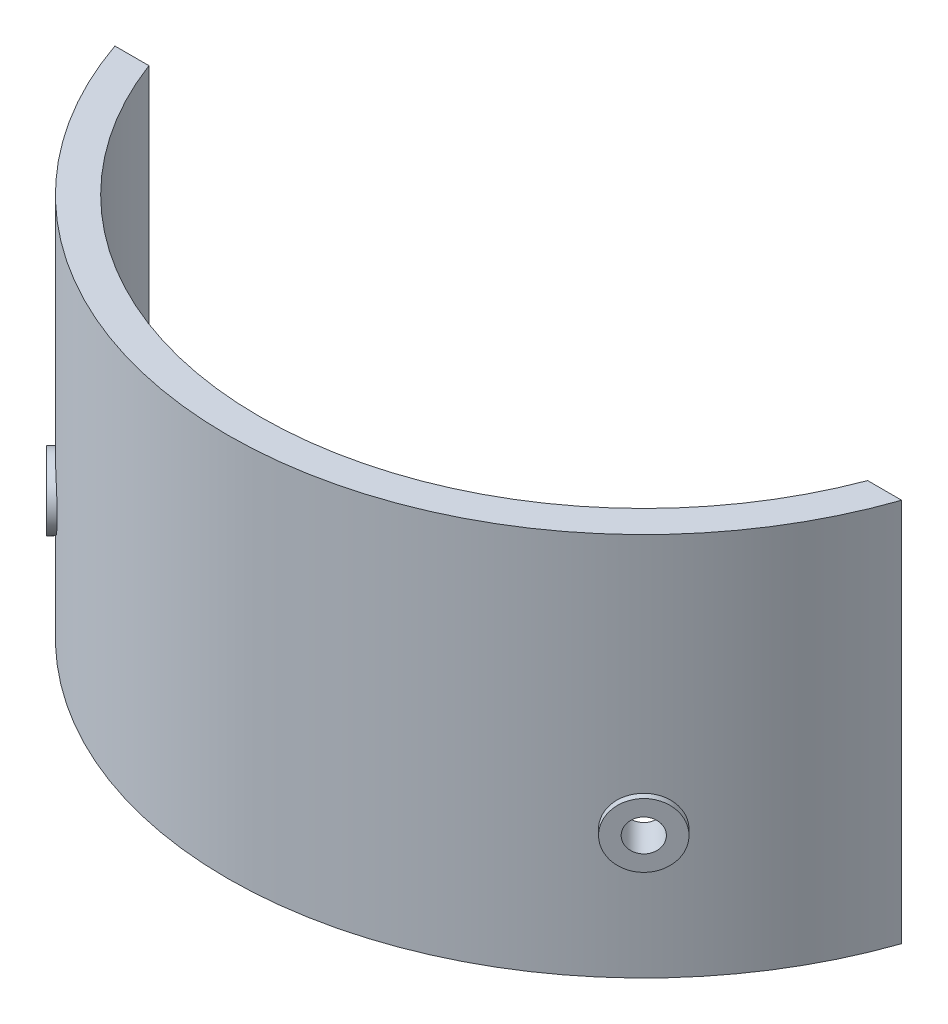
ISO-10303-21;
HEADER;
FILE_DESCRIPTION(('STEP AP214'),'2;1');
FILE_NAME('part.step','',(''),(''),'','','');
FILE_SCHEMA(('AUTOMOTIVE_DESIGN { 1 0 10303 214 1 1 1 1 }'));
ENDSEC;
DATA;
#1=APPLICATION_CONTEXT('core data for automotive mechanical design processes');
#2=APPLICATION_PROTOCOL_DEFINITION('international standard','automotive_design',2000,#1);
#3=PRODUCT_CONTEXT('',#1,'mechanical');
#4=PRODUCT('Part','Part','',(#3));
#5=PRODUCT_RELATED_PRODUCT_CATEGORY('part','',(#4));
#6=PRODUCT_DEFINITION_FORMATION('','',#4);
#7=PRODUCT_DEFINITION_CONTEXT('part definition',#1,'design');
#8=PRODUCT_DEFINITION('design','',#6,#7);
#9=PRODUCT_DEFINITION_SHAPE('','',#8);
#10=(LENGTH_UNIT() NAMED_UNIT(*) SI_UNIT(.MILLI.,.METRE.));
#11=(NAMED_UNIT(*) PLANE_ANGLE_UNIT() SI_UNIT($,.RADIAN.));
#12=(NAMED_UNIT(*) SI_UNIT($,.STERADIAN.) SOLID_ANGLE_UNIT());
#13=UNCERTAINTY_MEASURE_WITH_UNIT(LENGTH_MEASURE(1.E-05),#10,'distance_accuracy_value','');
#14=(GEOMETRIC_REPRESENTATION_CONTEXT(3) GLOBAL_UNCERTAINTY_ASSIGNED_CONTEXT((#13)) GLOBAL_UNIT_ASSIGNED_CONTEXT((#10,
#11,#12)) REPRESENTATION_CONTEXT('',''));
#15=CARTESIAN_POINT('',(0.,0.,0.));
#16=DIRECTION('',(0.,0.,1.));
#17=DIRECTION('',(1.,0.,0.));
#18=AXIS2_PLACEMENT_3D('',#15,#16,#17);
#19=CARTESIAN_POINT('',(0.,36.,0.));
#20=DIRECTION('',(0.,-1.,0.));
#21=DIRECTION('',(0.,0.,-1.));
#22=AXIS2_PLACEMENT_3D('',#19,#20,#21);
#23=CYLINDRICAL_SURFACE('',#22,36.);
#24=CARTESIAN_POINT('',(-26.4943976084996,12.,24.3730772649399));
#25=CARTESIAN_POINT('',(-26.4943952739119,11.9157835874304,24.3730801947325));
#26=CARTESIAN_POINT('',(-26.4895770731952,11.831507040874,24.3783205820329));
#27=CARTESIAN_POINT('',(-26.4704068180214,11.6652776602839,24.3991343156079));
#28=CARTESIAN_POINT('',(-26.456043456278,11.5833277025484,24.4147199168932));
#29=CARTESIAN_POINT('',(-26.4181422705606,11.4241836294283,24.455725996031));
#30=CARTESIAN_POINT('',(-26.3946090333823,11.346987158658,24.4811415568651));
#31=CARTESIAN_POINT('',(-26.33896364543,11.1995213175581,24.540999487088));
#32=CARTESIAN_POINT('',(-26.3068535526658,11.1292502910039,24.5754396909836));
#33=CARTESIAN_POINT('',(-26.2348406309579,10.9975563413775,24.6523001749192));
#34=CARTESIAN_POINT('',(-26.1949327728728,10.9361391732318,24.6947256043506));
#35=CARTESIAN_POINT('',(-26.1083602695939,10.8239452186071,24.7862357537321));
#36=CARTESIAN_POINT('',(-26.0616953519546,10.7731688613689,24.8353207421913));
#37=CARTESIAN_POINT('',(-25.9628122963476,10.6836840741825,24.9386745158446));
#38=CARTESIAN_POINT('',(-25.9105922455811,10.6449798191754,24.9929450859307));
#39=CARTESIAN_POINT('',(-25.8020073064117,10.5807647946425,25.1050293998376));
#40=CARTESIAN_POINT('',(-25.7456424423306,10.5552539477044,25.1628431228668));
#41=CARTESIAN_POINT('',(-25.6303418570092,10.5181642560097,25.2802757069657));
#42=CARTESIAN_POINT('',(-25.5714076619969,10.5065772540131,25.3398934901227));
#43=CARTESIAN_POINT('',(-25.4525837020591,10.4976390046214,25.4592433655442));
#44=CARTESIAN_POINT('',(-25.3926939428863,10.5002876715542,25.5189754571187));
#45=CARTESIAN_POINT('',(-25.2737047993608,10.5197387684018,25.6368261541523));
#46=CARTESIAN_POINT('',(-25.2146049474505,10.5365324111562,25.6949457381872));
#47=CARTESIAN_POINT('',(-25.0988752611399,10.5837831386145,25.8080028113925));
#48=CARTESIAN_POINT('',(-25.042245434756,10.6142402676591,25.8629402902357));
#49=CARTESIAN_POINT('',(-24.9331141735106,10.6879634533803,25.9681645796129));
#50=CARTESIAN_POINT('',(-24.880614039244,10.7312335250534,26.0184499258872));
#51=CARTESIAN_POINT('',(-24.7813408930378,10.8293513696792,26.1130207257994));
#52=CARTESIAN_POINT('',(-24.7345679084893,10.8841991980013,26.1573061507417));
#53=CARTESIAN_POINT('',(-24.6481442430487,11.0039653307972,26.2387599284347));
#54=CARTESIAN_POINT('',(-24.6084990028827,11.0688912582071,26.2759228458728));
#55=CARTESIAN_POINT('',(-24.5376037327839,11.2069437541272,26.3421404584948));
#56=CARTESIAN_POINT('',(-24.5063537046218,11.2800703243671,26.3711951519682));
#57=CARTESIAN_POINT('',(-24.4532291496454,11.4324528070875,26.4204637226725));
#58=CARTESIAN_POINT('',(-24.4313548195256,11.5117088481181,26.4406774144263));
#59=CARTESIAN_POINT('',(-24.3976764459135,11.674098455893,26.4717569057697));
#60=CARTESIAN_POINT('',(-24.385872349777,11.7572320023643,26.482622754227));
#61=CARTESIAN_POINT('',(-24.3727161490521,11.9249498126521,26.494731347306));
#62=CARTESIAN_POINT('',(-24.3713561917812,12.0095329385983,26.49598132186));
#63=CARTESIAN_POINT('',(-24.379111033573,12.1778077340019,26.4888461792357));
#64=CARTESIAN_POINT('',(-24.388225808752,12.2614994054916,26.4804610840267));
#65=CARTESIAN_POINT('',(-24.4166340781954,12.4255857324783,26.4542690221922));
#66=CARTESIAN_POINT('',(-24.4359239995682,12.5059815346113,26.4364653627864));
#67=CARTESIAN_POINT('',(-24.4840687251641,12.6612292529208,26.3918822530652));
#68=CARTESIAN_POINT('',(-24.5129235675519,12.7360811469753,26.3651027669355));
#69=CARTESIAN_POINT('',(-24.5793116970292,12.8781653761809,26.3032220281291));
#70=CARTESIAN_POINT('',(-24.6168501626974,12.9453931287933,26.2681158093917));
#71=CARTESIAN_POINT('',(-24.6994295967995,13.0702746620675,26.1904826344166));
#72=CARTESIAN_POINT('',(-24.7444705994151,13.1279283991077,26.1479556443696));
#73=CARTESIAN_POINT('',(-24.8407038090013,13.2320610504681,26.0565506637861));
#74=CARTESIAN_POINT('',(-24.8918997756704,13.2785330820084,26.0076687899338));
#75=CARTESIAN_POINT('',(-24.9988718094946,13.3589361096369,25.904862555006));
#76=CARTESIAN_POINT('',(-25.0546478612858,13.3928671477916,25.8509382108454));
#77=CARTESIAN_POINT('',(-25.1691001975252,13.4472129494855,25.7395176015354));
#78=CARTESIAN_POINT('',(-25.2277755247775,13.4676321423399,25.682022513678));
#79=CARTESIAN_POINT('',(-25.3463265227888,13.4943891401111,25.5650281534838));
#80=CARTESIAN_POINT('',(-25.4062021895074,13.5007269924174,25.5055288878925));
#81=CARTESIAN_POINT('',(-25.5253899339552,13.4991408989045,25.3862476950968));
#82=CARTESIAN_POINT('',(-25.58470240471,13.4912277667478,25.3264660165156));
#83=CARTESIAN_POINT('',(-25.7011457879523,13.4613866388985,25.2082920729372));
#84=CARTESIAN_POINT('',(-25.7582766962169,13.4394586160776,25.1498998106297));
#85=CARTESIAN_POINT('',(-25.8687903011385,13.3822121668092,25.036213340826));
#86=CARTESIAN_POINT('',(-25.9221729499724,13.3468935695511,24.9809191728594));
#87=CARTESIAN_POINT('',(-26.0237564298485,13.2638708757159,24.8750776667383));
#88=CARTESIAN_POINT('',(-26.0719574333728,13.2161671915831,24.8245301705879));
#89=CARTESIAN_POINT('',(-26.1619446460311,13.1096914207276,24.7296772549363));
#90=CARTESIAN_POINT('',(-26.203726658424,13.050912148212,24.6853759207241));
#91=CARTESIAN_POINT('',(-26.2797706924186,12.923951838657,24.6044050265411));
#92=CARTESIAN_POINT('',(-26.3140308556938,12.8557684850315,24.5677373526362));
#93=CARTESIAN_POINT('',(-26.3741711752369,12.7118948004059,24.503164073359));
#94=CARTESIAN_POINT('',(-26.4000445212428,12.6361984335083,24.4752655892971));
#95=CARTESIAN_POINT('',(-26.4426991242894,12.4795479402464,24.4291763771393));
#96=CARTESIAN_POINT('',(-26.4594911699732,12.3986001812397,24.410974130239));
#97=CARTESIAN_POINT('',(-26.4791413510393,12.2642878604451,24.389653333726));
#98=CARTESIAN_POINT('',(-26.4848559637558,12.211794164508,24.3834459589456));
#99=CARTESIAN_POINT('',(-26.4924848276024,12.1062082858077,24.3751570018301));
#100=CARTESIAN_POINT('',(-26.4943990809466,12.053116103393,24.3730754170915));
#101=CARTESIAN_POINT('',(-26.4943976084996,12.,24.3730772649399));
#102=B_SPLINE_CURVE_WITH_KNOTS('',3,(#24,#25,#26,#27,#28,#29,#30,#31,#32,#33,#34,#35,#36,#37,
#38,#39,#40,#41,#42,#43,#44,#45,#46,#47,#48,#49,#50,#51,#52,#53,#54,#55,#56,#57,#58,#59,#60,#61,
#62,#63,#64,#65,#66,#67,#68,#69,#70,#71,#72,#73,#74,#75,#76,#77,#78,#79,#80,#81,#82,#83,#84,#85,
#86,#87,#88,#89,#90,#91,#92,#93,#94,#95,#96,#97,#98,#99,#100,#101),.UNSPECIFIED.,.T.,.F.,(4,2,2,
2,2,2,2,2,2,2,2,2,2,2,2,2,2,2,2,2,2,2,2,2,2,2,2,2,2,2,2,2,2,2,2,2,2,2,4),(0.,0.25245535001223,
0.505210295346108,0.757838973957758,1.01040708889073,1.26313863764075,1.51588037939217,
1.76870943111612,2.02153699935021,2.27421637703761,2.52689423406949,2.77941523790651,
3.03193706122855,3.28453809735155,3.53714034153854,3.78993459009669,4.04272889197808,
4.29552849702163,4.54832678049725,4.80093497274652,5.05354258901893,5.30606156387073,
5.55858154630133,5.81125251194071,6.06392462878274,6.31675187964327,6.5695782824301,
6.82232176513421,7.07506439725244,7.3276153287845,7.58016674917402,7.83272139122442,
8.08526762385798,8.33797827509739,8.59075129022817,8.84372905085045,9.09640560835673,
9.25563172445491,9.41485774779434),.UNSPECIFIED.);
#103=CARTESIAN_POINT('',(-26.4943976084996,12.,24.3730772649399));
#104=VERTEX_POINT('',#103);
#105=EDGE_CURVE('E221',#104,#104,#102,.T.);
#106=ORIENTED_EDGE('',*,*,#105,.T.);
#107=EDGE_LOOP('',(#106));
#108=FACE_BOUND('',#107,.T.);
#109=DIRECTION('',(0.,-1.,0.));
#110=VECTOR('',#109,1.);
#111=CARTESIAN_POINT('',(-7.02325159258064,29.7,35.3082700945163));
#112=LINE('',#111,#110);
#113=CARTESIAN_POINT('',(-7.02325159258064,29.7,35.3082700945163));
#114=VERTEX_POINT('',#113);
#115=CARTESIAN_POINT('',(-7.02325159258064,0.,35.3082700945163));
#116=VERTEX_POINT('',#115);
#117=EDGE_CURVE('E155',#114,#116,#112,.T.);
#118=ORIENTED_EDGE('',*,*,#117,.T.);
#119=CARTESIAN_POINT('',(0.,0.,0.));
#120=DIRECTION('',(0.,1.,0.));
#121=DIRECTION('',(0.,0.,1.));
#122=AXIS2_PLACEMENT_3D('',#119,#120,#121);
#123=CIRCLE('',#122,36.);
#124=CARTESIAN_POINT('',(-33.6854568026025,0.,12.7));
#125=VERTEX_POINT('',#124);
#126=EDGE_CURVE('E175',#125,#116,#123,.T.);
#127=ORIENTED_EDGE('',*,*,#126,.F.);
#128=DIRECTION('',(0.,-1.,0.));
#129=VECTOR('',#128,1.);
#130=CARTESIAN_POINT('',(-33.6854568026025,36.,12.7));
#131=LINE('',#130,#129);
#132=CARTESIAN_POINT('',(-33.6854568026025,36.,12.7));
#133=VERTEX_POINT('',#132);
#134=EDGE_CURVE('E70',#133,#125,#131,.T.);
#135=ORIENTED_EDGE('',*,*,#134,.F.);
#136=CARTESIAN_POINT('',(0.,36.,0.));
#137=DIRECTION('',(0.,1.,0.));
#138=DIRECTION('',(0.,0.,1.));
#139=AXIS2_PLACEMENT_3D('',#136,#137,#138);
#140=CIRCLE('',#139,36.);
#141=CARTESIAN_POINT('',(33.6854568026025,36.,12.7));
#142=VERTEX_POINT('',#141);
#143=EDGE_CURVE('E184',#133,#142,#140,.T.);
#144=ORIENTED_EDGE('',*,*,#143,.T.);
#145=DIRECTION('',(0.,-1.,0.));
#146=VECTOR('',#145,1.);
#147=CARTESIAN_POINT('',(33.6854568026025,36.,12.7));
#148=LINE('',#147,#146);
#149=CARTESIAN_POINT('',(33.6854568026025,0.,12.7));
#150=VERTEX_POINT('',#149);
#151=EDGE_CURVE('E161',#142,#150,#148,.T.);
#152=ORIENTED_EDGE('',*,*,#151,.T.);
#153=CARTESIAN_POINT('',(7.02325159258063,0.,35.3082700945163));
#154=VERTEX_POINT('',#153);
#155=EDGE_CURVE('E174',#154,#150,#123,.T.);
#156=ORIENTED_EDGE('',*,*,#155,.F.);
#157=DIRECTION('',(0.,-1.,0.));
#158=VECTOR('',#157,1.);
#159=CARTESIAN_POINT('',(7.02325159258063,29.7,35.3082700945163));
#160=LINE('',#159,#158);
#161=CARTESIAN_POINT('',(7.02325159258063,29.7,35.3082700945163));
#162=VERTEX_POINT('',#161);
#163=EDGE_CURVE('E127',#162,#154,#160,.T.);
#164=ORIENTED_EDGE('',*,*,#163,.F.);
#165=CARTESIAN_POINT('',(0.,29.7,0.));
#166=DIRECTION('',(0.,-1.,0.));
#167=DIRECTION('',(0.,0.,-1.));
#168=AXIS2_PLACEMENT_3D('',#165,#166,#167);
#169=CIRCLE('',#168,36.);
#170=EDGE_CURVE('E137',#162,#114,#169,.T.);
#171=ORIENTED_EDGE('',*,*,#170,.T.);
#172=EDGE_LOOP('',(#118,#127,#135,#144,#152,#156,#164,#171));
#173=FACE_BOUND('',#172,.T.);
#174=CARTESIAN_POINT('',(24.3730772649396,12.,26.4943976084999));
#175=CARTESIAN_POINT('',(24.3730801947322,11.9157835874304,26.4943952739121));
#176=CARTESIAN_POINT('',(24.3783205820326,11.831507040874,26.4895770731954));
#177=CARTESIAN_POINT('',(24.3991343156076,11.6652776602839,26.4704068180216));
#178=CARTESIAN_POINT('',(24.4147199168929,11.5833277025484,26.4560434562783));
#179=CARTESIAN_POINT('',(24.4557259960308,11.4241836294283,26.4181422705609));
#180=CARTESIAN_POINT('',(24.4811415568648,11.346987158658,26.3946090333825));
#181=CARTESIAN_POINT('',(24.5409994870878,11.1995213175581,26.3389636454303));
#182=CARTESIAN_POINT('',(24.5754396909833,11.1292502910039,26.306853552666));
#183=CARTESIAN_POINT('',(24.6523001749189,10.9975563413775,26.2348406309582));
#184=CARTESIAN_POINT('',(24.6947256043503,10.9361391732318,26.1949327728731));
#185=CARTESIAN_POINT('',(24.7862357537318,10.8239452186071,26.1083602695941));
#186=CARTESIAN_POINT('',(24.835320742191,10.7731688613689,26.0616953519549));
#187=CARTESIAN_POINT('',(24.9386745158443,10.6836840741825,25.9628122963478));
#188=CARTESIAN_POINT('',(24.9929450859304,10.6449798191754,25.9105922455814));
#189=CARTESIAN_POINT('',(25.1050293998373,10.5807647946425,25.802007306412));
#190=CARTESIAN_POINT('',(25.1628431228665,10.5552539477044,25.7456424423309));
#191=CARTESIAN_POINT('',(25.2802757069655,10.5181642560097,25.6303418570095));
#192=CARTESIAN_POINT('',(25.3398934901224,10.5065772540131,25.5714076619972));
#193=CARTESIAN_POINT('',(25.459243365544,10.4976390046214,25.4525837020593));
#194=CARTESIAN_POINT('',(25.5189754571184,10.5002876715542,25.3926939428866));
#195=CARTESIAN_POINT('',(25.6368261541521,10.5197387684018,25.2737047993611));
#196=CARTESIAN_POINT('',(25.694945738187,10.5365324111562,25.2146049474508));
#197=CARTESIAN_POINT('',(25.8080028113922,10.5837831386145,25.0988752611402));
#198=CARTESIAN_POINT('',(25.8629402902355,10.6142402676591,25.0422454347563));
#199=CARTESIAN_POINT('',(25.9681645796127,10.6879634533803,24.9331141735109));
#200=CARTESIAN_POINT('',(26.0184499258869,10.7312335250534,24.8806140392442));
#201=CARTESIAN_POINT('',(26.1130207257991,10.8293513696792,24.781340893038));
#202=CARTESIAN_POINT('',(26.1573061507414,10.8841991980013,24.7345679084896));
#203=CARTESIAN_POINT('',(26.2387599284345,11.0039653307972,24.648144243049));
#204=CARTESIAN_POINT('',(26.2759228458726,11.0688912582071,24.608499002883));
#205=CARTESIAN_POINT('',(26.3421404584945,11.2069437541272,24.5376037327842));
#206=CARTESIAN_POINT('',(26.371195151968,11.2800703243671,24.5063537046221));
#207=CARTESIAN_POINT('',(26.4204637226722,11.4324528070875,24.4532291496456));
#208=CARTESIAN_POINT('',(26.440677414426,11.5117088481181,24.4313548195259));
#209=CARTESIAN_POINT('',(26.4717569057694,11.674098455893,24.3976764459138));
#210=CARTESIAN_POINT('',(26.4826227542267,11.7572320023643,24.3858723497773));
#211=CARTESIAN_POINT('',(26.4947313473058,11.9249498126521,24.3727161490523));
#212=CARTESIAN_POINT('',(26.4959813218597,12.0095329385983,24.3713561917814));
#213=CARTESIAN_POINT('',(26.4888461792355,12.1778077340019,24.3791110335733));
#214=CARTESIAN_POINT('',(26.4804610840264,12.2614994054916,24.3882258087523));
#215=CARTESIAN_POINT('',(26.4542690221919,12.4255857324783,24.4166340781957));
#216=CARTESIAN_POINT('',(26.4364653627862,12.5059815346113,24.4359239995684));
#217=CARTESIAN_POINT('',(26.3918822530649,12.6612292529208,24.4840687251643));
#218=CARTESIAN_POINT('',(26.3651027669352,12.7360811469753,24.5129235675521));
#219=CARTESIAN_POINT('',(26.3032220281288,12.8781653761809,24.5793116970295));
#220=CARTESIAN_POINT('',(26.2681158093914,12.9453931287933,24.6168501626976));
#221=CARTESIAN_POINT('',(26.1904826344163,13.0702746620675,24.6994295967998));
#222=CARTESIAN_POINT('',(26.1479556443694,13.1279283991077,24.7444705994153));
#223=CARTESIAN_POINT('',(26.0565506637858,13.2320610504681,24.8407038090016));
#224=CARTESIAN_POINT('',(26.0076687899335,13.2785330820084,24.8918997756707));
#225=CARTESIAN_POINT('',(25.9048625550057,13.3589361096369,24.9988718094949));
#226=CARTESIAN_POINT('',(25.8509382108451,13.3928671477916,25.0546478612861));
#227=CARTESIAN_POINT('',(25.7395176015352,13.4472129494855,25.1691001975255));
#228=CARTESIAN_POINT('',(25.6820225136778,13.4676321423399,25.2277755247778));
#229=CARTESIAN_POINT('',(25.5650281534835,13.4943891401111,25.3463265227891));
#230=CARTESIAN_POINT('',(25.5055288878923,13.5007269924174,25.4062021895077));
#231=CARTESIAN_POINT('',(25.3862476950966,13.4991408989045,25.5253899339555));
#232=CARTESIAN_POINT('',(25.3264660165153,13.4912277667478,25.5847024047102));
#233=CARTESIAN_POINT('',(25.2082920729369,13.4613866388985,25.7011457879526));
#234=CARTESIAN_POINT('',(25.1498998106294,13.4394586160776,25.7582766962172));
#235=CARTESIAN_POINT('',(25.0362133408257,13.3822121668092,25.8687903011388));
#236=CARTESIAN_POINT('',(24.9809191728591,13.3468935695511,25.9221729499726));
#237=CARTESIAN_POINT('',(24.875077666738,13.2638708757159,26.0237564298488));
#238=CARTESIAN_POINT('',(24.8245301705876,13.2161671915831,26.0719574333731));
#239=CARTESIAN_POINT('',(24.729677254936,13.1096914207276,26.1619446460314));
#240=CARTESIAN_POINT('',(24.6853759207238,13.050912148212,26.2037266584242));
#241=CARTESIAN_POINT('',(24.6044050265408,12.923951838657,26.2797706924189));
#242=CARTESIAN_POINT('',(24.5677373526359,12.8557684850315,26.3140308556941));
#243=CARTESIAN_POINT('',(24.5031640733587,12.7118948004059,26.3741711752372));
#244=CARTESIAN_POINT('',(24.4752655892968,12.6361984335083,26.400044521243));
#245=CARTESIAN_POINT('',(24.429176377139,12.4795479402464,26.4426991242896));
#246=CARTESIAN_POINT('',(24.4109741302388,12.3986001812397,26.4594911699735));
#247=CARTESIAN_POINT('',(24.3896533337257,12.2642878604451,26.4791413510396));
#248=CARTESIAN_POINT('',(24.3834459589453,12.211794164508,26.484855963756));
#249=CARTESIAN_POINT('',(24.3751570018298,12.1062082858077,26.4924848276027));
#250=CARTESIAN_POINT('',(24.3730754170912,12.053116103393,26.4943990809469));
#251=CARTESIAN_POINT('',(24.3730772649396,12.,26.4943976084999));
#252=B_SPLINE_CURVE_WITH_KNOTS('',3,(#174,#175,#176,#177,#178,#179,#180,#181,#182,#183,#184,
#185,#186,#187,#188,#189,#190,#191,#192,#193,#194,#195,#196,#197,#198,#199,#200,#201,#202,#203,
#204,#205,#206,#207,#208,#209,#210,#211,#212,#213,#214,#215,#216,#217,#218,#219,#220,#221,#222,
#223,#224,#225,#226,#227,#228,#229,#230,#231,#232,#233,#234,#235,#236,#237,#238,#239,#240,#241,
#242,#243,#244,#245,#246,#247,#248,#249,#250,#251),.UNSPECIFIED.,.T.,.F.,(4,2,2,2,2,2,2,2,2,2,2,
2,2,2,2,2,2,2,2,2,2,2,2,2,2,2,2,2,2,2,2,2,2,2,2,2,2,2,4),(0.,0.252455350012232,
0.505210295346109,0.757838973957758,1.01040708889074,1.26313863764075,1.51588037939218,
1.76870943111613,2.02153699935021,2.27421637703762,2.52689423406949,2.77941523790651,
3.03193706122855,3.28453809735155,3.53714034153854,3.78993459009669,4.04272889197808,
4.29552849702163,4.54832678049725,4.80093497274653,5.05354258901893,5.30606156387073,
5.55858154630133,5.81125251194072,6.06392462878274,6.31675187964327,6.5695782824301,
6.82232176513421,7.07506439725244,7.3276153287845,7.58016674917402,7.83272139122442,
8.08526762385797,8.33797827509738,8.59075129022817,8.84372905085045,9.09640560835673,
9.25563172445491,9.41485774779434),.UNSPECIFIED.);
#253=CARTESIAN_POINT('',(24.3730772649396,12.,26.4943976084999));
#254=VERTEX_POINT('',#253);
#255=EDGE_CURVE('E227',#254,#254,#252,.T.);
#256=ORIENTED_EDGE('',*,*,#255,.T.);
#257=EDGE_LOOP('',(#256));
#258=FACE_BOUND('',#257,.T.);
#259=ADVANCED_FACE('F41',(#108,#173,#258),#23,.F.);
#260=CARTESIAN_POINT('',(0.,36.,0.));
#261=DIRECTION('',(0.,-1.,0.));
#262=DIRECTION('',(0.,0.,-1.));
#263=AXIS2_PLACEMENT_3D('',#260,#261,#262);
#264=CYLINDRICAL_SURFACE('',#263,39.);
#265=CARTESIAN_POINT('',(0.,0.,0.));
#266=DIRECTION('',(0.,1.,0.));
#267=DIRECTION('',(0.,0.,1.));
#268=AXIS2_PLACEMENT_3D('',#265,#266,#267);
#269=CIRCLE('',#268,39.);
#270=CARTESIAN_POINT('',(-36.8742457549982,0.,12.7));
#271=VERTEX_POINT('',#270);
#272=CARTESIAN_POINT('',(36.8742457549982,0.,12.7));
#273=VERTEX_POINT('',#272);
#274=EDGE_CURVE('E168',#271,#273,#269,.T.);
#275=ORIENTED_EDGE('',*,*,#274,.T.);
#276=DIRECTION('',(0.,-1.,0.));
#277=VECTOR('',#276,1.);
#278=CARTESIAN_POINT('',(36.8742457549982,36.,12.7));
#279=LINE('',#278,#277);
#280=CARTESIAN_POINT('',(36.8742457549982,36.,12.7));
#281=VERTEX_POINT('',#280);
#282=EDGE_CURVE('E164',#281,#273,#279,.T.);
#283=ORIENTED_EDGE('',*,*,#282,.F.);
#284=CARTESIAN_POINT('',(0.,36.,0.));
#285=DIRECTION('',(0.,1.,0.));
#286=DIRECTION('',(0.,0.,1.));
#287=AXIS2_PLACEMENT_3D('',#284,#285,#286);
#288=CIRCLE('',#287,39.);
#289=CARTESIAN_POINT('',(-36.8742457549982,36.,12.7));
#290=VERTEX_POINT('',#289);
#291=EDGE_CURVE('E160',#290,#281,#288,.T.);
#292=ORIENTED_EDGE('',*,*,#291,.F.);
#293=DIRECTION('',(0.,-1.,0.));
#294=VECTOR('',#293,1.);
#295=CARTESIAN_POINT('',(-36.8742457549982,36.,12.7));
#296=LINE('',#295,#294);
#297=EDGE_CURVE('E95',#290,#271,#296,.T.);
#298=ORIENTED_EDGE('',*,*,#297,.T.);
#299=EDGE_LOOP('',(#275,#283,#292,#298));
#300=FACE_BOUND('',#299,.T.);
#301=CARTESIAN_POINT('',(-29.6167745132947,12.,25.3741338261753));
#302=CARTESIAN_POINT('',(-29.6167703892068,11.8317563580693,25.374140122723));
#303=CARTESIAN_POINT('',(-29.6075136193557,11.6633970730493,25.3849555531861));
#304=CARTESIAN_POINT('',(-29.5706573966522,11.3313335808803,25.4278782135208));
#305=CARTESIAN_POINT('',(-29.5430369684712,11.1676349204174,25.4600097910189));
#306=CARTESIAN_POINT('',(-29.4700636048256,10.8497503329696,25.5444406103474));
#307=CARTESIAN_POINT('',(-29.4247204879615,10.6955591933615,25.5967286849954));
#308=CARTESIAN_POINT('',(-29.3173134482018,10.4009912377379,25.7196765774581));
#309=CARTESIAN_POINT('',(-29.2552531856693,10.2606114067928,25.7903323733838));
#310=CARTESIAN_POINT('',(-29.1156631143574,9.99730315201715,25.9478172863148));
#311=CARTESIAN_POINT('',(-29.0381033034713,9.87440937789568,26.0346777482932));
#312=CARTESIAN_POINT('',(-28.8693821441368,9.64985910532357,26.2216436794332));
#313=CARTESIAN_POINT('',(-28.7782202109418,9.5482035203403,26.3217497179926));
#314=CARTESIAN_POINT('',(-28.5843677667292,9.3689022933837,26.5321385066022));
#315=CARTESIAN_POINT('',(-28.4816632383633,9.29128628403443,26.6424336006977));
#316=CARTESIAN_POINT('',(-28.2674060176029,9.16245701757628,26.8696504419556));
#317=CARTESIAN_POINT('',(-28.1558534597345,9.11124335913332,26.9865720883597));
#318=CARTESIAN_POINT('',(-27.9270776582669,9.03677134922049,27.2232502446689));
#319=CARTESIAN_POINT('',(-27.8098661790017,9.0134573974671,27.3430006297112));
#320=CARTESIAN_POINT('',(-27.5728000998067,8.99527477639575,27.5820417084649));
#321=CARTESIAN_POINT('',(-27.4529455425237,9.00040564844515,27.701332409557));
#322=CARTESIAN_POINT('',(-27.2142881171598,9.03892143254379,27.9358275115182));
#323=CARTESIAN_POINT('',(-27.0954835606269,9.07224655055241,28.0510400230454));
#324=CARTESIAN_POINT('',(-26.8621839368522,9.16611193568756,28.2745324839));
#325=CARTESIAN_POINT('',(-26.7476889054436,9.22665242905296,28.3828123755885));
#326=CARTESIAN_POINT('',(-26.5263794325687,9.37329704628585,28.5897568380121));
#327=CARTESIAN_POINT('',(-26.4195732167386,9.45942805691856,28.6884111500567));
#328=CARTESIAN_POINT('',(-26.2171166757375,9.65478923553223,28.8735457066861));
#329=CARTESIAN_POINT('',(-26.1214665428762,9.76401980161444,28.9600257414147));
#330=CARTESIAN_POINT('',(-25.9441616214552,10.0028166773519,29.1189753185405));
#331=CARTESIAN_POINT('',(-25.8625437228595,10.1324349243876,29.1914079932553));
#332=CARTESIAN_POINT('',(-25.7163040608494,10.4081464542395,29.320321269622));
#333=CARTESIAN_POINT('',(-25.6516823086264,10.554239747904,29.3768018607701));
#334=CARTESIAN_POINT('',(-25.5416155720294,10.8587897698059,29.4725503200981));
#335=CARTESIAN_POINT('',(-25.4961724762585,11.017247713823,29.5118164931163));
#336=CARTESIAN_POINT('',(-25.4260434453132,11.3420122996648,29.5722585667523));
#337=CARTESIAN_POINT('',(-25.4013571390373,11.5083188011125,29.5934347907923));
#338=CARTESIAN_POINT('',(-25.3736414966486,11.8436037853732,29.6172020366645));
#339=CARTESIAN_POINT('',(-25.3705568667867,12.0125743357674,29.6198405095819));
#340=CARTESIAN_POINT('',(-25.3860062540962,12.3487915577451,29.6066003779526));
#341=CARTESIAN_POINT('',(-25.404540099858,12.5160382429863,29.5907219202239));
#342=CARTESIAN_POINT('',(-25.4625420616586,12.8438527058744,29.5408259405859));
#343=CARTESIAN_POINT('',(-25.5019846021963,13.0044283852815,29.5068305789914));
#344=CARTESIAN_POINT('',(-25.6004290860745,13.3145871604526,29.421459021747));
#345=CARTESIAN_POINT('',(-25.6594312974568,13.4641701055401,29.3700825879101));
#346=CARTESIAN_POINT('',(-25.7951388073246,13.7484301913544,29.2509649568117));
#347=CARTESIAN_POINT('',(-25.871879743836,13.8830765067133,29.1831908026968));
#348=CARTESIAN_POINT('',(-26.0404541469052,14.1333300188947,29.032868751662));
#349=CARTESIAN_POINT('',(-26.1322878351625,14.2489369359953,28.950320637724));
#350=CARTESIAN_POINT('',(-26.3282828826741,14.458077111847,28.7721924736702));
#351=CARTESIAN_POINT('',(-26.4324698705387,14.5515632312098,28.6765852659805));
#352=CARTESIAN_POINT('',(-26.6497095368078,14.713484945232,28.4748121742954));
#353=CARTESIAN_POINT('',(-26.7627621379405,14.7819207581978,28.3686463823255));
#354=CARTESIAN_POINT('',(-26.9941096073926,14.8917179063374,28.1485964753376));
#355=CARTESIAN_POINT('',(-27.1123986373831,14.9331086220301,28.0347208848562));
#356=CARTESIAN_POINT('',(-27.3507795449008,14.9877367133743,27.8022043733138));
#357=CARTESIAN_POINT('',(-27.4708713938202,15.0009745352902,27.6835635278194));
#358=CARTESIAN_POINT('',(-27.7090588759536,14.9989161904282,27.4451521800783));
#359=CARTESIAN_POINT('',(-27.8271588617564,14.9836935890383,27.3253853842586));
#360=CARTESIAN_POINT('',(-28.0583955692782,14.9252996271078,27.0878924616598));
#361=CARTESIAN_POINT('',(-28.1715322834885,14.8821282242871,26.9701663379679));
#362=CARTESIAN_POINT('',(-28.389828149811,14.7690801970709,26.7402842832356));
#363=CARTESIAN_POINT('',(-28.4949876037148,14.6992045835402,26.62812814153));
#364=CARTESIAN_POINT('',(-28.6946651919278,14.5347404776448,26.4128335119586));
#365=CARTESIAN_POINT('',(-28.7891835306423,14.4401524600969,26.3096948508845));
#366=CARTESIAN_POINT('',(-28.965510143614,14.228673064583,26.1154456721008));
#367=CARTESIAN_POINT('',(-29.0472866498848,14.1117275100512,26.0243653004536));
#368=CARTESIAN_POINT('',(-29.1959559080991,13.858945027947,25.8574686720673));
#369=CARTESIAN_POINT('',(-29.2628450383739,13.7231035165661,25.781656129976));
#370=CARTESIAN_POINT('',(-29.3802927709474,13.4361586874857,25.6477361276264));
#371=CARTESIAN_POINT('',(-29.4308241439698,13.2850304665303,25.5896581975878));
#372=CARTESIAN_POINT('',(-29.5142334344049,12.9720887260489,25.493413237354));
#373=CARTESIAN_POINT('',(-29.5471317773601,12.8102878146003,25.4552231711523));
#374=CARTESIAN_POINT('',(-29.5861348065904,12.5396000762966,25.4098630172455));
#375=CARTESIAN_POINT('',(-29.5976126529756,12.4324573106733,25.396485304453));
#376=CARTESIAN_POINT('',(-29.6129338272695,12.2168923844066,25.3786186890577));
#377=CARTESIAN_POINT('',(-29.6167771721812,12.1084702266131,25.3741297666582));
#378=CARTESIAN_POINT('',(-29.6167745132947,12.,25.3741338261753));
#379=B_SPLINE_CURVE_WITH_KNOTS('',3,(#301,#302,#303,#304,#305,#306,#307,#308,#309,#310,#311,
#312,#313,#314,#315,#316,#317,#318,#319,#320,#321,#322,#323,#324,#325,#326,#327,#328,#329,#330,
#331,#332,#333,#334,#335,#336,#337,#338,#339,#340,#341,#342,#343,#344,#345,#346,#347,#348,#349,
#350,#351,#352,#353,#354,#355,#356,#357,#358,#359,#360,#361,#362,#363,#364,#365,#366,#367,#368,
#369,#370,#371,#372,#373,#374,#375,#376,#377,#378),.UNSPECIFIED.,.T.,.F.,(4,2,2,2,2,2,2,2,2,2,2,
2,2,2,2,2,2,2,2,2,2,2,2,2,2,2,2,2,2,2,2,2,2,2,2,2,2,2,4),(0.,0.504334901911673,1.00924685692242,
1.51387947971789,2.0184016985413,2.5239101370218,3.02944031325183,3.53559117882701,
4.04173435033008,4.54686715925977,5.05199182365951,5.55604790296609,6.06010817252101,
6.56469991885809,7.06930036211435,7.57520773415136,8.08111543931165,8.5870729517191,
9.09302141814287,9.59767433479893,10.1023232501645,10.6063562988773,11.1103962550427,
11.6154577931867,12.1205267509048,12.6266625072118,13.1327938525825,13.6383744425073,
14.1439470181863,14.6482145805461,15.1524829057505,15.6567321442059,16.1609716948803,
16.6664489666365,17.1720490723318,17.6784865278456,18.1843360674415,18.5094921464959,
18.8346475013818),.UNSPECIFIED.);
#380=CARTESIAN_POINT('',(-29.6167745132947,12.,25.3741338261753));
#381=VERTEX_POINT('',#380);
#382=EDGE_CURVE('E54',#381,#381,#379,.T.);
#383=ORIENTED_EDGE('',*,*,#382,.F.);
#384=EDGE_LOOP('',(#383));
#385=FACE_BOUND('',#384,.T.);
#386=CARTESIAN_POINT('',(25.374133826175,12.,29.616774513295));
#387=CARTESIAN_POINT('',(25.3741401227226,11.8317563580693,29.6167703892071));
#388=CARTESIAN_POINT('',(25.3849555531858,11.6633970730493,29.607513619356));
#389=CARTESIAN_POINT('',(25.4278782135204,11.3313335808803,29.5706573966524));
#390=CARTESIAN_POINT('',(25.4600097910186,11.1676349204174,29.5430369684715));
#391=CARTESIAN_POINT('',(25.5444406103471,10.8497503329696,29.4700636048258));
#392=CARTESIAN_POINT('',(25.5967286849951,10.6955591933615,29.4247204879618));
#393=CARTESIAN_POINT('',(25.7196765774578,10.4009912377379,29.3173134482021));
#394=CARTESIAN_POINT('',(25.7903323733834,10.2606114067928,29.2552531856696));
#395=CARTESIAN_POINT('',(25.9478172863145,9.99730315201715,29.1156631143576));
#396=CARTESIAN_POINT('',(26.0346777482929,9.87440937789567,29.0381033034716));
#397=CARTESIAN_POINT('',(26.2216436794329,9.64985910532357,28.8693821441371));
#398=CARTESIAN_POINT('',(26.3217497179923,9.5482035203403,28.7782202109421));
#399=CARTESIAN_POINT('',(26.5321385066019,9.3689022933837,28.5843677667295));
#400=CARTESIAN_POINT('',(26.6424336006974,9.29128628403443,28.4816632383635));
#401=CARTESIAN_POINT('',(26.8696504419553,9.16245701757628,28.2674060176032));
#402=CARTESIAN_POINT('',(26.9865720883594,9.11124335913332,28.1558534597348));
#403=CARTESIAN_POINT('',(27.2232502446686,9.03677134922049,27.9270776582672));
#404=CARTESIAN_POINT('',(27.3430006297109,9.0134573974671,27.809866179002));
#405=CARTESIAN_POINT('',(27.5820417084646,8.99527477639575,27.5728000998069));
#406=CARTESIAN_POINT('',(27.7013324095567,9.00040564844515,27.452945542524));
#407=CARTESIAN_POINT('',(27.9358275115179,9.03892143254379,27.2142881171601));
#408=CARTESIAN_POINT('',(28.0510400230451,9.07224655055241,27.0954835606272));
#409=CARTESIAN_POINT('',(28.2745324838997,9.16611193568756,26.8621839368525));
#410=CARTESIAN_POINT('',(28.3828123755883,9.22665242905296,26.7476889054439));
#411=CARTESIAN_POINT('',(28.5897568380118,9.37329704628585,26.526379432569));
#412=CARTESIAN_POINT('',(28.6884111500564,9.45942805691856,26.4195732167389));
#413=CARTESIAN_POINT('',(28.8735457066858,9.65478923553224,26.2171166757378));
#414=CARTESIAN_POINT('',(28.9600257414144,9.76401980161444,26.1214665428765));
#415=CARTESIAN_POINT('',(29.1189753185403,10.0028166773519,25.9441616214555));
#416=CARTESIAN_POINT('',(29.191407993255,10.1324349243876,25.8625437228598));
#417=CARTESIAN_POINT('',(29.3203212696217,10.4081464542395,25.7163040608497));
#418=CARTESIAN_POINT('',(29.3768018607698,10.554239747904,25.6516823086268));
#419=CARTESIAN_POINT('',(29.4725503200978,10.8587897698059,25.5416155720298));
#420=CARTESIAN_POINT('',(29.5118164931161,11.017247713823,25.4961724762589));
#421=CARTESIAN_POINT('',(29.572258566752,11.3420122996648,25.4260434453135));
#422=CARTESIAN_POINT('',(29.593434790792,11.5083188011125,25.4013571390376));
#423=CARTESIAN_POINT('',(29.6172020366643,11.8436037853732,25.3736414966489));
#424=CARTESIAN_POINT('',(29.6198405095816,12.0125743357674,25.370556866787));
#425=CARTESIAN_POINT('',(29.6066003779524,12.3487915577451,25.3860062540965));
#426=CARTESIAN_POINT('',(29.5907219202237,12.5160382429863,25.4045400998583));
#427=CARTESIAN_POINT('',(29.5408259405856,12.8438527058744,25.4625420616589));
#428=CARTESIAN_POINT('',(29.5068305789912,13.0044283852815,25.5019846021967));
#429=CARTESIAN_POINT('',(29.4214590217467,13.3145871604526,25.6004290860749));
#430=CARTESIAN_POINT('',(29.3700825879098,13.4641701055401,25.6594312974571));
#431=CARTESIAN_POINT('',(29.2509649568114,13.7484301913544,25.7951388073249));
#432=CARTESIAN_POINT('',(29.1831908026965,13.8830765067133,25.8718797438363));
#433=CARTESIAN_POINT('',(29.0328687516617,14.1333300188947,26.0404541469055));
#434=CARTESIAN_POINT('',(28.9503206377237,14.2489369359953,26.1322878351628));
#435=CARTESIAN_POINT('',(28.7721924736699,14.458077111847,26.3282828826744));
#436=CARTESIAN_POINT('',(28.6765852659802,14.5515632312098,26.4324698705391));
#437=CARTESIAN_POINT('',(28.4748121742951,14.713484945232,26.6497095368081));
#438=CARTESIAN_POINT('',(28.3686463823252,14.7819207581978,26.7627621379408));
#439=CARTESIAN_POINT('',(28.1485964753373,14.8917179063374,26.9941096073928));
#440=CARTESIAN_POINT('',(28.0347208848559,14.9331086220301,27.1123986373834));
#441=CARTESIAN_POINT('',(27.8022043733135,14.9877367133743,27.3507795449011));
#442=CARTESIAN_POINT('',(27.6835635278191,15.0009745352902,27.4708713938204));
#443=CARTESIAN_POINT('',(27.445152180078,14.9989161904282,27.7090588759539));
#444=CARTESIAN_POINT('',(27.3253853842584,14.9836935890383,27.8271588617567));
#445=CARTESIAN_POINT('',(27.0878924616595,14.9252996271078,28.0583955692785));
#446=CARTESIAN_POINT('',(26.9701663379676,14.8821282242871,28.1715322834888));
#447=CARTESIAN_POINT('',(26.7402842832353,14.7690801970709,28.3898281498113));
#448=CARTESIAN_POINT('',(26.6281281415297,14.6992045835402,28.4949876037151));
#449=CARTESIAN_POINT('',(26.4128335119583,14.5347404776448,28.6946651919281));
#450=CARTESIAN_POINT('',(26.3096948508842,14.4401524600969,28.7891835306425));
#451=CARTESIAN_POINT('',(26.1154456721005,14.2286730645829,28.9655101436143));
#452=CARTESIAN_POINT('',(26.0243653004533,14.1117275100512,29.0472866498851));
#453=CARTESIAN_POINT('',(25.857468672067,13.858945027947,29.1959559080993));
#454=CARTESIAN_POINT('',(25.7816561299757,13.7231035165661,29.2628450383742));
#455=CARTESIAN_POINT('',(25.6477361276261,13.4361586874857,29.3802927709477));
#456=CARTESIAN_POINT('',(25.5896581975875,13.2850304665303,29.4308241439701));
#457=CARTESIAN_POINT('',(25.4934132373537,12.9720887260489,29.5142334344052));
#458=CARTESIAN_POINT('',(25.455223171152,12.8102878146003,29.5471317773604));
#459=CARTESIAN_POINT('',(25.4098630172452,12.5396000762966,29.5861348065906));
#460=CARTESIAN_POINT('',(25.3964853044527,12.4324573106733,29.5976126529759));
#461=CARTESIAN_POINT('',(25.3786186890574,12.2168923844066,29.6129338272698));
#462=CARTESIAN_POINT('',(25.3741297666579,12.1084702266131,29.6167771721815));
#463=CARTESIAN_POINT('',(25.374133826175,12.,29.616774513295));
#464=B_SPLINE_CURVE_WITH_KNOTS('',3,(#386,#387,#388,#389,#390,#391,#392,#393,#394,#395,#396,
#397,#398,#399,#400,#401,#402,#403,#404,#405,#406,#407,#408,#409,#410,#411,#412,#413,#414,#415,
#416,#417,#418,#419,#420,#421,#422,#423,#424,#425,#426,#427,#428,#429,#430,#431,#432,#433,#434,
#435,#436,#437,#438,#439,#440,#441,#442,#443,#444,#445,#446,#447,#448,#449,#450,#451,#452,#453,
#454,#455,#456,#457,#458,#459,#460,#461,#462,#463),.UNSPECIFIED.,.T.,.F.,(4,2,2,2,2,2,2,2,2,2,2,
2,2,2,2,2,2,2,2,2,2,2,2,2,2,2,2,2,2,2,2,2,2,2,2,2,2,2,4),(0.,0.504334901911675,1.00924685692242,
1.51387947971789,2.0184016985413,2.5239101370218,3.02944031325183,3.53559117882701,
4.04173435033008,4.54686715925977,5.05199182365951,5.55604790296609,6.06010817252101,
6.56469991885809,7.06930036211435,7.57520773415136,8.08111543931165,8.58707295171911,
9.09302141814288,9.59767433479893,10.1023232501645,10.6063562988773,11.1103962550427,
11.6154577931867,12.1205267509048,12.6266625072118,13.1327938525825,13.6383744425073,
14.1439470181863,14.6482145805461,15.1524829057505,15.6567321442059,16.1609716948803,
16.6664489666365,17.1720490723318,17.6784865278456,18.1843360674415,18.5094921464959,
18.8346475013818),.UNSPECIFIED.);
#465=CARTESIAN_POINT('',(25.374133826175,12.,29.616774513295));
#466=VERTEX_POINT('',#465);
#467=EDGE_CURVE('E11',#466,#466,#464,.T.);
#468=ORIENTED_EDGE('',*,*,#467,.F.);
#469=EDGE_LOOP('',(#468));
#470=FACE_BOUND('',#469,.T.);
#471=ADVANCED_FACE('F191',(#300,#385,#470),#264,.T.);
#472=CARTESIAN_POINT('',(-36.8742457549982,36.,12.7));
#473=DIRECTION('',(0.,0.,-1.));
#474=DIRECTION('',(-1.,0.,0.));
#475=AXIS2_PLACEMENT_3D('',#472,#473,#474);
#476=PLANE('',#475);
#477=DIRECTION('',(1.,0.,0.));
#478=VECTOR('',#477,1.);
#479=CARTESIAN_POINT('',(-36.8742457549982,0.,12.7));
#480=LINE('',#479,#478);
#481=EDGE_CURVE('E178',#271,#125,#480,.T.);
#482=ORIENTED_EDGE('',*,*,#481,.F.);
#483=ORIENTED_EDGE('',*,*,#297,.F.);
#484=DIRECTION('',(1.,0.,0.));
#485=VECTOR('',#484,1.);
#486=CARTESIAN_POINT('',(-36.8742457549982,36.,12.7));
#487=LINE('',#486,#485);
#488=EDGE_CURVE('E171',#290,#133,#487,.T.);
#489=ORIENTED_EDGE('',*,*,#488,.T.);
#490=ORIENTED_EDGE('',*,*,#134,.T.);
#491=EDGE_LOOP('',(#482,#483,#489,#490));
#492=FACE_BOUND('',#491,.T.);
#493=ADVANCED_FACE('F213',(#492),#476,.T.);
#494=CARTESIAN_POINT('',(36.8742457549982,36.,12.7));
#495=DIRECTION('',(0.,0.,1.));
#496=DIRECTION('',(1.,0.,0.));
#497=AXIS2_PLACEMENT_3D('',#494,#495,#496);
#498=PLANE('',#497);
#499=DIRECTION('',(-1.,0.,0.));
#500=VECTOR('',#499,1.);
#501=CARTESIAN_POINT('',(36.8742457549982,0.,12.7));
#502=LINE('',#501,#500);
#503=EDGE_CURVE('E170',#273,#150,#502,.T.);
#504=ORIENTED_EDGE('',*,*,#503,.T.);
#505=ORIENTED_EDGE('',*,*,#151,.F.);
#506=DIRECTION('',(-1.,0.,0.));
#507=VECTOR('',#506,1.);
#508=CARTESIAN_POINT('',(36.8742457549982,36.,12.7));
#509=LINE('',#508,#507);
#510=EDGE_CURVE('E182',#281,#142,#509,.T.);
#511=ORIENTED_EDGE('',*,*,#510,.F.);
#512=ORIENTED_EDGE('',*,*,#282,.T.);
#513=EDGE_LOOP('',(#504,#505,#511,#512));
#514=FACE_BOUND('',#513,.T.);
#515=ADVANCED_FACE('F216',(#514),#498,.F.);
#516=CARTESIAN_POINT('',(0.,36.,0.));
#517=DIRECTION('',(0.,1.,0.));
#518=DIRECTION('',(0.,0.,1.));
#519=AXIS2_PLACEMENT_3D('',#516,#517,#518);
#520=PLANE('',#519);
#521=ORIENTED_EDGE('',*,*,#488,.F.);
#522=ORIENTED_EDGE('',*,*,#291,.T.);
#523=ORIENTED_EDGE('',*,*,#510,.T.);
#524=ORIENTED_EDGE('',*,*,#143,.F.);
#525=EDGE_LOOP('',(#521,#522,#523,#524));
#526=FACE_BOUND('',#525,.T.);
#527=ADVANCED_FACE('F43',(#526),#520,.T.);
#528=CARTESIAN_POINT('',(0.,0.,0.));
#529=DIRECTION('',(0.,1.,0.));
#530=DIRECTION('',(0.,0.,1.));
#531=AXIS2_PLACEMENT_3D('',#528,#529,#530);
#532=PLANE('',#531);
#533=ORIENTED_EDGE('',*,*,#481,.T.);
#534=ORIENTED_EDGE('',*,*,#126,.T.);
#535=DIRECTION('',(0.195090322016129,0.,-0.98078528040323));
#536=VECTOR('',#535,1.);
#537=CARTESIAN_POINT('',(-6.43798062653225,0.,32.3659142533066));
#538=LINE('',#537,#536);
#539=CARTESIAN_POINT('',(-6.43798062653225,0.,32.3659142533066));
#540=VERTEX_POINT('',#539);
#541=EDGE_CURVE('E141',#116,#540,#538,.T.);
#542=ORIENTED_EDGE('',*,*,#541,.T.);
#543=CARTESIAN_POINT('',(0.,0.,0.));
#544=DIRECTION('',(0.,1.,0.));
#545=DIRECTION('',(0.,0.,-1.));
#546=AXIS2_PLACEMENT_3D('',#543,#544,#545);
#547=CIRCLE('',#546,33.);
#548=CARTESIAN_POINT('',(6.43798062653225,0.,32.3659142533066));
#549=VERTEX_POINT('',#548);
#550=EDGE_CURVE('E151',#540,#549,#547,.T.);
#551=ORIENTED_EDGE('',*,*,#550,.T.);
#552=DIRECTION('',(0.195090322016129,0.,0.98078528040323));
#553=VECTOR('',#552,1.);
#554=CARTESIAN_POINT('',(6.43798062653225,0.,32.3659142533066));
#555=LINE('',#554,#553);
#556=EDGE_CURVE('E61',#549,#154,#555,.T.);
#557=ORIENTED_EDGE('',*,*,#556,.T.);
#558=ORIENTED_EDGE('',*,*,#155,.T.);
#559=ORIENTED_EDGE('',*,*,#503,.F.);
#560=ORIENTED_EDGE('',*,*,#274,.F.);
#561=EDGE_LOOP('',(#533,#534,#542,#551,#557,#558,#559,#560));
#562=FACE_BOUND('',#561,.T.);
#563=ADVANCED_FACE('F212',(#562),#532,.F.);
#564=CARTESIAN_POINT('',(0.,29.7,0.));
#565=DIRECTION('',(0.,-1.,0.));
#566=DIRECTION('',(0.,0.,-1.));
#567=AXIS2_PLACEMENT_3D('',#564,#565,#566);
#568=CYLINDRICAL_SURFACE('',#567,33.);
#569=ORIENTED_EDGE('',*,*,#550,.F.);
#570=DIRECTION('',(0.,-1.,0.));
#571=VECTOR('',#570,1.);
#572=CARTESIAN_POINT('',(-6.43798062653225,29.7,32.3659142533066));
#573=LINE('',#572,#571);
#574=CARTESIAN_POINT('',(-6.43798062653225,29.7,32.3659142533066));
#575=VERTEX_POINT('',#574);
#576=EDGE_CURVE('E140',#575,#540,#573,.T.);
#577=ORIENTED_EDGE('',*,*,#576,.F.);
#578=CARTESIAN_POINT('',(0.,29.7,0.));
#579=DIRECTION('',(0.,1.,0.));
#580=DIRECTION('',(0.,0.,-1.));
#581=AXIS2_PLACEMENT_3D('',#578,#579,#580);
#582=CIRCLE('',#581,33.);
#583=CARTESIAN_POINT('',(6.43798062653225,29.7,32.3659142533066));
#584=VERTEX_POINT('',#583);
#585=EDGE_CURVE('E134',#575,#584,#582,.T.);
#586=ORIENTED_EDGE('',*,*,#585,.T.);
#587=DIRECTION('',(0.,-1.,0.));
#588=VECTOR('',#587,1.);
#589=CARTESIAN_POINT('',(6.43798062653225,29.7,32.3659142533066));
#590=LINE('',#589,#588);
#591=EDGE_CURVE('E119',#584,#549,#590,.T.);
#592=ORIENTED_EDGE('',*,*,#591,.T.);
#593=EDGE_LOOP('',(#569,#577,#586,#592));
#594=FACE_BOUND('',#593,.T.);
#595=ADVANCED_FACE('F139',(#594),#568,.F.);
#596=CARTESIAN_POINT('',(-6.43798062653225,29.7,32.3659142533066));
#597=DIRECTION('',(-0.98078528040323,0.,-0.195090322016129));
#598=DIRECTION('',(-0.195090322016129,0.,0.98078528040323));
#599=AXIS2_PLACEMENT_3D('',#596,#597,#598);
#600=PLANE('',#599);
#601=ORIENTED_EDGE('',*,*,#541,.F.);
#602=ORIENTED_EDGE('',*,*,#117,.F.);
#603=DIRECTION('',(0.195090322016129,0.,-0.98078528040323));
#604=VECTOR('',#603,1.);
#605=CARTESIAN_POINT('',(-6.43798062653225,29.7,32.3659142533066));
#606=LINE('',#605,#604);
#607=EDGE_CURVE('E128',#114,#575,#606,.T.);
#608=ORIENTED_EDGE('',*,*,#607,.T.);
#609=ORIENTED_EDGE('',*,*,#576,.T.);
#610=EDGE_LOOP('',(#601,#602,#608,#609));
#611=FACE_BOUND('',#610,.T.);
#612=ADVANCED_FACE('F204',(#611),#600,.T.);
#613=CARTESIAN_POINT('',(6.43798062653225,29.7,32.3659142533066));
#614=DIRECTION('',(0.98078528040323,0.,-0.195090322016129));
#615=DIRECTION('',(-0.195090322016129,0.,-0.980785280403231));
#616=AXIS2_PLACEMENT_3D('',#613,#614,#615);
#617=PLANE('',#616);
#618=ORIENTED_EDGE('',*,*,#556,.F.);
#619=ORIENTED_EDGE('',*,*,#591,.F.);
#620=DIRECTION('',(0.195090322016129,0.,0.98078528040323));
#621=VECTOR('',#620,1.);
#622=CARTESIAN_POINT('',(6.43798062653225,29.7,32.3659142533066));
#623=LINE('',#622,#621);
#624=EDGE_CURVE('E122',#584,#162,#623,.T.);
#625=ORIENTED_EDGE('',*,*,#624,.T.);
#626=ORIENTED_EDGE('',*,*,#163,.T.);
#627=EDGE_LOOP('',(#618,#619,#625,#626));
#628=FACE_BOUND('',#627,.T.);
#629=ADVANCED_FACE('F121',(#628),#617,.T.);
#630=CARTESIAN_POINT('',(0.,29.7,0.));
#631=DIRECTION('',(0.,-1.,0.));
#632=DIRECTION('',(0.,0.,-1.));
#633=AXIS2_PLACEMENT_3D('',#630,#631,#632);
#634=PLANE('',#633);
#635=ORIENTED_EDGE('',*,*,#585,.F.);
#636=ORIENTED_EDGE('',*,*,#607,.F.);
#637=ORIENTED_EDGE('',*,*,#170,.F.);
#638=ORIENTED_EDGE('',*,*,#624,.F.);
#639=EDGE_LOOP('',(#635,#636,#637,#638));
#640=FACE_BOUND('',#639,.T.);
#641=ADVANCED_FACE('F132',(#640),#634,.F.);
#642=CARTESIAN_POINT('',(-28.0010545133699,12.,28.0010545133698));
#643=DIRECTION('',(0.707106781186549,0.,-0.707106781186546));
#644=DIRECTION('',(-0.707106781186546,0.,-0.707106781186549));
#645=AXIS2_PLACEMENT_3D('',#642,#643,#644);
#646=CYLINDRICAL_SURFACE('',#645,3.);
#647=CARTESIAN_POINT('',(-28.0010545133699,12.,28.0010545133698));
#648=DIRECTION('',(-0.707106781186549,0.,0.707106781186546));
#649=DIRECTION('',(0.707106781186546,0.,0.707106781186549));
#650=AXIS2_PLACEMENT_3D('',#647,#648,#649);
#651=CIRCLE('',#650,3.);
#652=CARTESIAN_POINT('',(-25.8797341698102,12.,30.1223748569294));
#653=VERTEX_POINT('',#652);
#654=EDGE_CURVE('E146',#653,#653,#651,.T.);
#655=ORIENTED_EDGE('',*,*,#654,.F.);
#656=EDGE_LOOP('',(#655));
#657=FACE_BOUND('',#656,.T.);
#658=ORIENTED_EDGE('',*,*,#382,.T.);
#659=EDGE_LOOP('',(#658));
#660=FACE_BOUND('',#659,.T.);
#661=ADVANCED_FACE('F194',(#657,#660),#646,.T.);
#662=CARTESIAN_POINT('',(-28.0010545133699,12.,28.0010545133698));
#663=DIRECTION('',(-0.707106781186549,0.,0.707106781186546));
#664=DIRECTION('',(0.707106781186546,0.,0.707106781186549));
#665=AXIS2_PLACEMENT_3D('',#662,#663,#664);
#666=PLANE('',#665);
#667=CARTESIAN_POINT('',(-28.0010545133697,12.,28.00105451337));
#668=DIRECTION('',(0.707106781186544,0.,-0.707106781186551));
#669=DIRECTION('',(-0.707106781186551,0.,-0.707106781186544));
#670=AXIS2_PLACEMENT_3D('',#667,#668,#669);
#671=CIRCLE('',#670,1.5);
#672=CARTESIAN_POINT('',(-29.0617146851495,12.,26.9403943415901));
#673=VERTEX_POINT('',#672);
#674=EDGE_CURVE('E235',#673,#673,#671,.T.);
#675=ORIENTED_EDGE('',*,*,#674,.T.);
#676=EDGE_LOOP('',(#675));
#677=FACE_BOUND('',#676,.T.);
#678=ORIENTED_EDGE('',*,*,#654,.T.);
#679=EDGE_LOOP('',(#678));
#680=FACE_BOUND('',#679,.T.);
#681=ADVANCED_FACE('F199',(#677,#680),#666,.T.);
#682=CARTESIAN_POINT('',(-37.9371228774991,12.,37.937122877499));
#683=DIRECTION('',(0.707106781186549,0.,-0.707106781186546));
#684=DIRECTION('',(-0.707106781186546,0.,-0.707106781186549));
#685=AXIS2_PLACEMENT_3D('',#682,#683,#684);
#686=CYLINDRICAL_SURFACE('',#685,1.5);
#687=ORIENTED_EDGE('',*,*,#105,.F.);
#688=EDGE_LOOP('',(#687));
#689=FACE_BOUND('',#688,.T.);
#690=ORIENTED_EDGE('',*,*,#674,.F.);
#691=EDGE_LOOP('',(#690));
#692=FACE_BOUND('',#691,.T.);
#693=ADVANCED_FACE('F249',(#689,#692),#686,.F.);
#694=CARTESIAN_POINT('',(28.0010545133695,12.,28.0010545133701));
#695=DIRECTION('',(-0.707106781186539,0.,-0.707106781186556));
#696=DIRECTION('',(-0.707106781186556,0.,0.707106781186539));
#697=AXIS2_PLACEMENT_3D('',#694,#695,#696);
#698=CYLINDRICAL_SURFACE('',#697,3.);
#699=CARTESIAN_POINT('',(28.0010545133695,12.,28.0010545133701));
#700=DIRECTION('',(0.707106781186539,0.,0.707106781186556));
#701=DIRECTION('',(0.707106781186556,0.,-0.707106781186539));
#702=AXIS2_PLACEMENT_3D('',#699,#700,#701);
#703=CIRCLE('',#702,3.);
#704=CARTESIAN_POINT('',(30.1223748569291,12.,25.8797341698105));
#705=VERTEX_POINT('',#704);
#706=EDGE_CURVE('E234',#705,#705,#703,.T.);
#707=ORIENTED_EDGE('',*,*,#706,.F.);
#708=EDGE_LOOP('',(#707));
#709=FACE_BOUND('',#708,.T.);
#710=ORIENTED_EDGE('',*,*,#467,.T.);
#711=EDGE_LOOP('',(#710));
#712=FACE_BOUND('',#711,.T.);
#713=ADVANCED_FACE('F245',(#709,#712),#698,.T.);
#714=CARTESIAN_POINT('',(28.0010545133695,12.,28.0010545133701));
#715=DIRECTION('',(0.707106781186539,0.,0.707106781186556));
#716=DIRECTION('',(0.707106781186556,0.,-0.707106781186539));
#717=AXIS2_PLACEMENT_3D('',#714,#715,#716);
#718=PLANE('',#717);
#719=CARTESIAN_POINT('',(28.0010545133699,12.,28.0010545133698));
#720=DIRECTION('',(-0.707106781186549,0.,-0.707106781186546));
#721=DIRECTION('',(-0.707106781186546,0.,0.707106781186549));
#722=AXIS2_PLACEMENT_3D('',#719,#720,#721);
#723=CIRCLE('',#722,1.5);
#724=CARTESIAN_POINT('',(26.94039434159,12.,29.0617146851496));
#725=VERTEX_POINT('',#724);
#726=EDGE_CURVE('E236',#725,#725,#723,.T.);
#727=ORIENTED_EDGE('',*,*,#726,.T.);
#728=EDGE_LOOP('',(#727));
#729=FACE_BOUND('',#728,.T.);
#730=ORIENTED_EDGE('',*,*,#706,.T.);
#731=EDGE_LOOP('',(#730));
#732=FACE_BOUND('',#731,.T.);
#733=ADVANCED_FACE('F242',(#729,#732),#718,.T.);
#734=CARTESIAN_POINT('',(37.9371228774986,12.,37.9371228774996));
#735=DIRECTION('',(-0.707106781186539,0.,-0.707106781186556));
#736=DIRECTION('',(-0.707106781186556,0.,0.707106781186539));
#737=AXIS2_PLACEMENT_3D('',#734,#735,#736);
#738=CYLINDRICAL_SURFACE('',#737,1.5);
#739=ORIENTED_EDGE('',*,*,#255,.F.);
#740=EDGE_LOOP('',(#739));
#741=FACE_BOUND('',#740,.T.);
#742=ORIENTED_EDGE('',*,*,#726,.F.);
#743=EDGE_LOOP('',(#742));
#744=FACE_BOUND('',#743,.T.);
#745=ADVANCED_FACE('F238',(#741,#744),#738,.F.);
#746=CLOSED_SHELL('',(#259,#471,#493,#515,#527,#563,#595,#612,#629,#641,#661,#681,#693,#713,
#733,#745));
#747=MANIFOLD_SOLID_BREP('B2',#746);
#748=ADVANCED_BREP_SHAPE_REPRESENTATION('',(#18,#747),#14);
#749=SHAPE_DEFINITION_REPRESENTATION(#9,#748);
ENDSEC;
END-ISO-10303-21;
